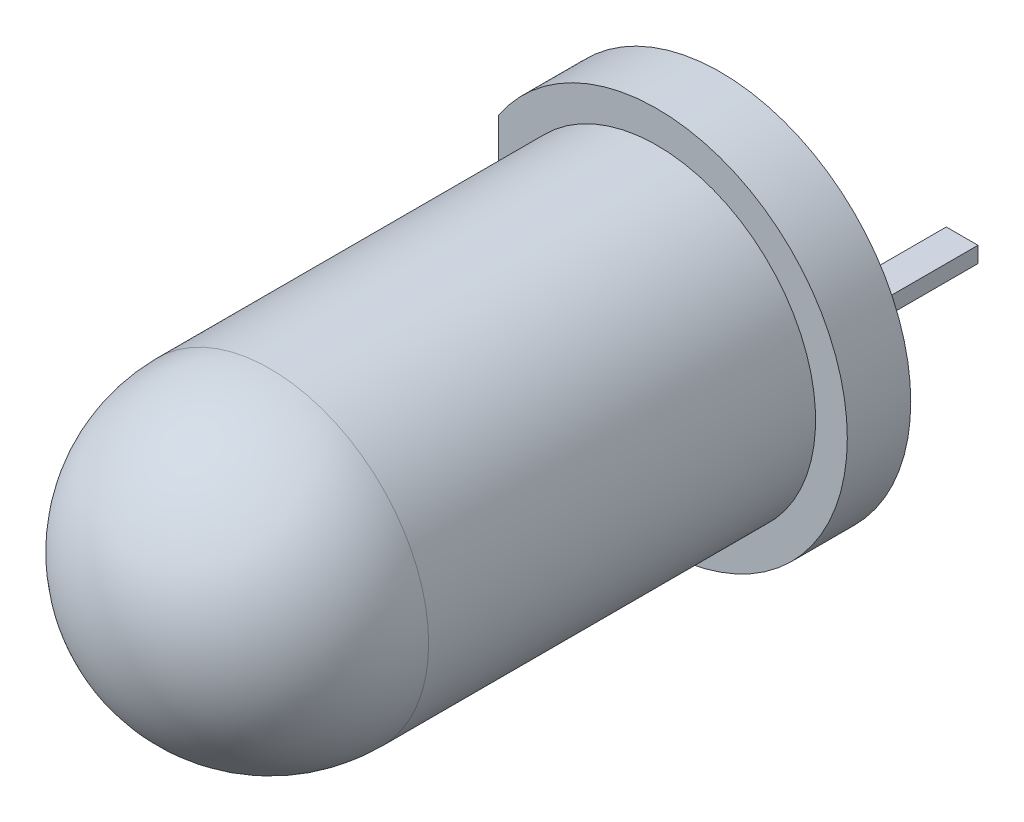
ISO-10303-21;
HEADER;
FILE_DESCRIPTION(('STEP AP214'),'2;1');
FILE_NAME('part.step','',(''),(''),'','','');
FILE_SCHEMA(('AUTOMOTIVE_DESIGN { 1 0 10303 214 1 1 1 1 }'));
ENDSEC;
DATA;
#1=APPLICATION_CONTEXT('core data for automotive mechanical design processes');
#2=APPLICATION_PROTOCOL_DEFINITION('international standard','automotive_design',2000,#1);
#3=PRODUCT_CONTEXT('',#1,'mechanical');
#4=PRODUCT('Part','Part','',(#3));
#5=PRODUCT_RELATED_PRODUCT_CATEGORY('part','',(#4));
#6=PRODUCT_DEFINITION_FORMATION('','',#4);
#7=PRODUCT_DEFINITION_CONTEXT('part definition',#1,'design');
#8=PRODUCT_DEFINITION('design','',#6,#7);
#9=PRODUCT_DEFINITION_SHAPE('','',#8);
#10=(LENGTH_UNIT() NAMED_UNIT(*) SI_UNIT(.MILLI.,.METRE.));
#11=(NAMED_UNIT(*) PLANE_ANGLE_UNIT() SI_UNIT($,.RADIAN.));
#12=(NAMED_UNIT(*) SI_UNIT($,.STERADIAN.) SOLID_ANGLE_UNIT());
#13=UNCERTAINTY_MEASURE_WITH_UNIT(LENGTH_MEASURE(1.E-05),#10,'distance_accuracy_value','');
#14=(GEOMETRIC_REPRESENTATION_CONTEXT(3) GLOBAL_UNCERTAINTY_ASSIGNED_CONTEXT((#13)) GLOBAL_UNIT_ASSIGNED_CONTEXT((#10,
#11,#12)) REPRESENTATION_CONTEXT('',''));
#15=CARTESIAN_POINT('',(0.,0.,0.));
#16=DIRECTION('',(0.,0.,1.));
#17=DIRECTION('',(1.,0.,0.));
#18=AXIS2_PLACEMENT_3D('',#15,#16,#17);
#19=CARTESIAN_POINT('',(-1.52,0.125000000000001,-3.54));
#20=DIRECTION('',(1.,0.,0.));
#21=DIRECTION('',(0.,1.,0.));
#22=AXIS2_PLACEMENT_3D('',#19,#20,#21);
#23=PLANE('',#22);
#24=DIRECTION('',(0.,1.,0.));
#25=VECTOR('',#24,1.);
#26=CARTESIAN_POINT('',(-1.52,0.125000000000001,-2.54));
#27=LINE('',#26,#25);
#28=CARTESIAN_POINT('',(-1.52,-0.124999999999999,-2.54));
#29=VERTEX_POINT('',#28);
#30=CARTESIAN_POINT('',(-1.52,0.125000000000001,-2.54));
#31=VERTEX_POINT('',#30);
#32=EDGE_CURVE('E124',#29,#31,#27,.T.);
#33=ORIENTED_EDGE('',*,*,#32,.F.);
#34=DIRECTION('',(0.,0.,1.));
#35=VECTOR('',#34,1.);
#36=CARTESIAN_POINT('',(-1.52,-0.124999999999999,-3.54));
#37=LINE('',#36,#35);
#38=CARTESIAN_POINT('',(-1.52,-0.124999999999999,-1.));
#39=VERTEX_POINT('',#38);
#40=EDGE_CURVE('E130',#29,#39,#37,.T.);
#41=ORIENTED_EDGE('',*,*,#40,.T.);
#42=DIRECTION('',(0.,1.,0.));
#43=VECTOR('',#42,1.);
#44=CARTESIAN_POINT('',(-1.52,0.125000000000001,-1.));
#45=LINE('',#44,#43);
#46=CARTESIAN_POINT('',(-1.52,0.125000000000001,-1.));
#47=VERTEX_POINT('',#46);
#48=EDGE_CURVE('E170',#39,#47,#45,.T.);
#49=ORIENTED_EDGE('',*,*,#48,.T.);
#50=DIRECTION('',(0.,0.,1.));
#51=VECTOR('',#50,1.);
#52=CARTESIAN_POINT('',(-1.52,0.125000000000001,-3.54));
#53=LINE('',#52,#51);
#54=EDGE_CURVE('E131',#31,#47,#53,.T.);
#55=ORIENTED_EDGE('',*,*,#54,.F.);
#56=EDGE_LOOP('',(#33,#41,#49,#55));
#57=FACE_BOUND('',#56,.T.);
#58=ADVANCED_FACE('F45',(#57),#23,.F.);
#59=CARTESIAN_POINT('',(-1.02,0.125000000000001,-3.54));
#60=DIRECTION('',(0.,-1.,0.));
#61=DIRECTION('',(1.,0.,0.));
#62=AXIS2_PLACEMENT_3D('',#59,#60,#61);
#63=PLANE('',#62);
#64=DIRECTION('',(1.,0.,0.));
#65=VECTOR('',#64,1.);
#66=CARTESIAN_POINT('',(-1.02,0.125000000000001,-2.54));
#67=LINE('',#66,#65);
#68=CARTESIAN_POINT('',(-1.02,0.125000000000001,-2.54));
#69=VERTEX_POINT('',#68);
#70=EDGE_CURVE('E133',#31,#69,#67,.T.);
#71=ORIENTED_EDGE('',*,*,#70,.F.);
#72=ORIENTED_EDGE('',*,*,#54,.T.);
#73=DIRECTION('',(1.,0.,0.));
#74=VECTOR('',#73,1.);
#75=CARTESIAN_POINT('',(-1.02,0.125000000000001,-1.));
#76=LINE('',#75,#74);
#77=CARTESIAN_POINT('',(-1.02,0.125000000000001,-1.));
#78=VERTEX_POINT('',#77);
#79=EDGE_CURVE('E420',#47,#78,#76,.T.);
#80=ORIENTED_EDGE('',*,*,#79,.T.);
#81=DIRECTION('',(0.,0.,1.));
#82=VECTOR('',#81,1.);
#83=CARTESIAN_POINT('',(-1.02,0.125000000000001,-3.54));
#84=LINE('',#83,#82);
#85=EDGE_CURVE('E140',#69,#78,#84,.T.);
#86=ORIENTED_EDGE('',*,*,#85,.F.);
#87=EDGE_LOOP('',(#71,#72,#80,#86));
#88=FACE_BOUND('',#87,.T.);
#89=ADVANCED_FACE('F215',(#88),#63,.F.);
#90=CARTESIAN_POINT('',(-1.02,0.125000000000001,-3.54));
#91=DIRECTION('',(-1.,0.,0.));
#92=DIRECTION('',(0.,0.,1.));
#93=AXIS2_PLACEMENT_3D('',#90,#91,#92);
#94=PLANE('',#93);
#95=DIRECTION('',(0.,-1.,0.));
#96=VECTOR('',#95,1.);
#97=CARTESIAN_POINT('',(-1.02,0.125000000000001,-2.54));
#98=LINE('',#97,#96);
#99=CARTESIAN_POINT('',(-1.02,-0.124999999999999,-2.54));
#100=VERTEX_POINT('',#99);
#101=EDGE_CURVE('E59',#69,#100,#98,.T.);
#102=ORIENTED_EDGE('',*,*,#101,.F.);
#103=ORIENTED_EDGE('',*,*,#85,.T.);
#104=DIRECTION('',(0.,-1.,0.));
#105=VECTOR('',#104,1.);
#106=CARTESIAN_POINT('',(-1.02,0.125000000000001,-1.));
#107=LINE('',#106,#105);
#108=CARTESIAN_POINT('',(-1.02,-0.124999999999999,-1.));
#109=VERTEX_POINT('',#108);
#110=EDGE_CURVE('E142',#78,#109,#107,.T.);
#111=ORIENTED_EDGE('',*,*,#110,.T.);
#112=DIRECTION('',(0.,0.,1.));
#113=VECTOR('',#112,1.);
#114=CARTESIAN_POINT('',(-1.02,-0.124999999999999,-3.54));
#115=LINE('',#114,#113);
#116=EDGE_CURVE('E66',#100,#109,#115,.T.);
#117=ORIENTED_EDGE('',*,*,#116,.F.);
#118=EDGE_LOOP('',(#102,#103,#111,#117));
#119=FACE_BOUND('',#118,.T.);
#120=ADVANCED_FACE('F220',(#119),#94,.F.);
#121=CARTESIAN_POINT('',(-1.02,-0.124999999999999,-3.54));
#122=DIRECTION('',(0.,1.,0.));
#123=DIRECTION('',(-1.,0.,0.));
#124=AXIS2_PLACEMENT_3D('',#121,#122,#123);
#125=PLANE('',#124);
#126=DIRECTION('',(-1.,0.,0.));
#127=VECTOR('',#126,1.);
#128=CARTESIAN_POINT('',(-1.02,-0.124999999999999,-2.54));
#129=LINE('',#128,#127);
#130=EDGE_CURVE('E11',#100,#29,#129,.T.);
#131=ORIENTED_EDGE('',*,*,#130,.F.);
#132=ORIENTED_EDGE('',*,*,#116,.T.);
#133=DIRECTION('',(-1.,0.,0.));
#134=VECTOR('',#133,1.);
#135=CARTESIAN_POINT('',(-1.02,-0.124999999999999,-1.));
#136=LINE('',#135,#134);
#137=EDGE_CURVE('E137',#109,#39,#136,.T.);
#138=ORIENTED_EDGE('',*,*,#137,.T.);
#139=ORIENTED_EDGE('',*,*,#40,.F.);
#140=EDGE_LOOP('',(#131,#132,#138,#139));
#141=FACE_BOUND('',#140,.T.);
#142=ADVANCED_FACE('F135',(#141),#125,.F.);
#143=CARTESIAN_POINT('',(0.,0.,-1.));
#144=DIRECTION('',(0.,0.,-1.));
#145=DIRECTION('',(-1.,0.,0.));
#146=AXIS2_PLACEMENT_3D('',#143,#144,#145);
#147=PLANE('',#146);
#148=DIRECTION('',(0.,1.,0.));
#149=VECTOR('',#148,1.);
#150=CARTESIAN_POINT('',(-2.5,0.,-1.));
#151=LINE('',#150,#149);
#152=CARTESIAN_POINT('',(-2.5,-1.6583123951777,-1.));
#153=VERTEX_POINT('',#152);
#154=CARTESIAN_POINT('',(-2.5,1.6583123951777,-1.));
#155=VERTEX_POINT('',#154);
#156=EDGE_CURVE('E178',#153,#155,#151,.T.);
#157=ORIENTED_EDGE('',*,*,#156,.T.);
#158=CARTESIAN_POINT('',(0.,0.,-1.));
#159=DIRECTION('',(0.,0.,-1.));
#160=DIRECTION('',(-1.,0.,0.));
#161=AXIS2_PLACEMENT_3D('',#158,#159,#160);
#162=CIRCLE('',#161,3.);
#163=EDGE_CURVE('E180',#155,#153,#162,.T.);
#164=ORIENTED_EDGE('',*,*,#163,.T.);
#165=EDGE_LOOP('',(#157,#164));
#166=FACE_BOUND('',#165,.T.);
#167=DIRECTION('',(-1.,0.,0.));
#168=VECTOR('',#167,1.);
#169=CARTESIAN_POINT('',(1.02,-0.125,-1.));
#170=LINE('',#169,#168);
#171=CARTESIAN_POINT('',(1.52,-0.125,-1.));
#172=VERTEX_POINT('',#171);
#173=CARTESIAN_POINT('',(1.02,-0.125,-1.));
#174=VERTEX_POINT('',#173);
#175=EDGE_CURVE('E165',#172,#174,#170,.T.);
#176=ORIENTED_EDGE('',*,*,#175,.F.);
#177=DIRECTION('',(0.,-1.,0.));
#178=VECTOR('',#177,1.);
#179=CARTESIAN_POINT('',(1.52,0.125,-1.));
#180=LINE('',#179,#178);
#181=CARTESIAN_POINT('',(1.52,0.125,-1.));
#182=VERTEX_POINT('',#181);
#183=EDGE_CURVE('E167',#182,#172,#180,.T.);
#184=ORIENTED_EDGE('',*,*,#183,.F.);
#185=DIRECTION('',(1.,0.,0.));
#186=VECTOR('',#185,1.);
#187=CARTESIAN_POINT('',(1.02,0.125,-1.));
#188=LINE('',#187,#186);
#189=CARTESIAN_POINT('',(1.02,0.125,-1.));
#190=VERTEX_POINT('',#189);
#191=EDGE_CURVE('E159',#190,#182,#188,.T.);
#192=ORIENTED_EDGE('',*,*,#191,.F.);
#193=DIRECTION('',(0.,1.,0.));
#194=VECTOR('',#193,1.);
#195=CARTESIAN_POINT('',(1.02,0.125,-1.));
#196=LINE('',#195,#194);
#197=EDGE_CURVE('E161',#174,#190,#196,.T.);
#198=ORIENTED_EDGE('',*,*,#197,.F.);
#199=EDGE_LOOP('',(#176,#184,#192,#198));
#200=FACE_BOUND('',#199,.T.);
#201=ORIENTED_EDGE('',*,*,#79,.F.);
#202=ORIENTED_EDGE('',*,*,#48,.F.);
#203=ORIENTED_EDGE('',*,*,#137,.F.);
#204=ORIENTED_EDGE('',*,*,#110,.F.);
#205=EDGE_LOOP('',(#201,#202,#203,#204));
#206=FACE_BOUND('',#205,.T.);
#207=ADVANCED_FACE('F240',(#166,#200,#206),#147,.T.);
#208=CARTESIAN_POINT('',(0.,0.,8.6));
#209=DIRECTION('',(0.,0.,-1.));
#210=DIRECTION('',(-1.,0.,0.));
#211=AXIS2_PLACEMENT_3D('',#208,#209,#210);
#212=CYLINDRICAL_SURFACE('',#211,2.5);
#213=CARTESIAN_POINT('',(0.,0.,6.1));
#214=DIRECTION('',(0.,0.,-1.));
#215=DIRECTION('',(-1.,0.,0.));
#216=AXIS2_PLACEMENT_3D('',#213,#214,#215);
#217=CIRCLE('',#216,2.5);
#218=CARTESIAN_POINT('',(-2.5,0.,6.1));
#219=VERTEX_POINT('',#218);
#220=EDGE_CURVE('E53',#219,#219,#217,.T.);
#221=ORIENTED_EDGE('',*,*,#220,.T.);
#222=EDGE_LOOP('',(#221));
#223=FACE_BOUND('',#222,.T.);
#224=CARTESIAN_POINT('',(0.,0.,0.));
#225=DIRECTION('',(0.,0.,1.));
#226=DIRECTION('',(1.,0.,0.));
#227=AXIS2_PLACEMENT_3D('',#224,#225,#226);
#228=CIRCLE('',#227,2.5);
#229=CARTESIAN_POINT('',(-2.5,0.,0.));
#230=VERTEX_POINT('',#229);
#231=EDGE_CURVE('E193',#230,#230,#228,.T.);
#232=ORIENTED_EDGE('',*,*,#231,.T.);
#233=EDGE_LOOP('',(#232));
#234=FACE_BOUND('',#233,.T.);
#235=ADVANCED_FACE('F198',(#223,#234),#212,.T.);
#236=CARTESIAN_POINT('',(-2.5,0.,-1.));
#237=DIRECTION('',(1.,0.,0.));
#238=DIRECTION('',(0.,0.,-1.));
#239=AXIS2_PLACEMENT_3D('',#236,#237,#238);
#240=PLANE('',#239);
#241=DIRECTION('',(0.,1.,0.));
#242=VECTOR('',#241,1.);
#243=CARTESIAN_POINT('',(-2.5,0.,0.));
#244=LINE('',#243,#242);
#245=CARTESIAN_POINT('',(-2.5,-1.6583123951777,0.));
#246=VERTEX_POINT('',#245);
#247=EDGE_CURVE('E184',#246,#230,#244,.T.);
#248=ORIENTED_EDGE('',*,*,#247,.T.);
#249=CARTESIAN_POINT('',(-2.5,1.6583123951777,0.));
#250=VERTEX_POINT('',#249);
#251=EDGE_CURVE('E148',#230,#250,#244,.T.);
#252=ORIENTED_EDGE('',*,*,#251,.T.);
#253=DIRECTION('',(0.,0.,1.));
#254=VECTOR('',#253,1.);
#255=CARTESIAN_POINT('',(-2.5,1.6583123951777,-1.));
#256=LINE('',#255,#254);
#257=EDGE_CURVE('E190',#155,#250,#256,.T.);
#258=ORIENTED_EDGE('',*,*,#257,.F.);
#259=ORIENTED_EDGE('',*,*,#156,.F.);
#260=DIRECTION('',(0.,0.,1.));
#261=VECTOR('',#260,1.);
#262=CARTESIAN_POINT('',(-2.5,-1.6583123951777,-1.));
#263=LINE('',#262,#261);
#264=EDGE_CURVE('E183',#153,#246,#263,.T.);
#265=ORIENTED_EDGE('',*,*,#264,.T.);
#266=EDGE_LOOP('',(#248,#252,#258,#259,#265));
#267=FACE_BOUND('',#266,.T.);
#268=ADVANCED_FACE('F246',(#267),#240,.F.);
#269=CARTESIAN_POINT('',(0.,0.,-1.));
#270=DIRECTION('',(0.,0.,1.));
#271=DIRECTION('',(1.,0.,0.));
#272=AXIS2_PLACEMENT_3D('',#269,#270,#271);
#273=CYLINDRICAL_SURFACE('',#272,3.);
#274=CARTESIAN_POINT('',(0.,0.,0.));
#275=DIRECTION('',(0.,0.,-1.));
#276=DIRECTION('',(-1.,0.,0.));
#277=AXIS2_PLACEMENT_3D('',#274,#275,#276);
#278=CIRCLE('',#277,3.);
#279=EDGE_CURVE('E181',#250,#246,#278,.T.);
#280=ORIENTED_EDGE('',*,*,#279,.T.);
#281=ORIENTED_EDGE('',*,*,#264,.F.);
#282=ORIENTED_EDGE('',*,*,#163,.F.);
#283=ORIENTED_EDGE('',*,*,#257,.T.);
#284=EDGE_LOOP('',(#280,#281,#282,#283));
#285=FACE_BOUND('',#284,.T.);
#286=ADVANCED_FACE('F211',(#285),#273,.T.);
#287=CARTESIAN_POINT('',(0.,0.,0.));
#288=DIRECTION('',(0.,0.,-1.));
#289=DIRECTION('',(-1.,0.,0.));
#290=AXIS2_PLACEMENT_3D('',#287,#288,#289);
#291=PLANE('',#290);
#292=ORIENTED_EDGE('',*,*,#251,.F.);
#293=ORIENTED_EDGE('',*,*,#231,.F.);
#294=ORIENTED_EDGE('',*,*,#247,.F.);
#295=ORIENTED_EDGE('',*,*,#279,.F.);
#296=EDGE_LOOP('',(#292,#293,#294,#295));
#297=FACE_BOUND('',#296,.T.);
#298=ADVANCED_FACE('F203',(#297),#291,.F.);
#299=CARTESIAN_POINT('',(0.,0.,6.1));
#300=DIRECTION('',(0.,0.,1.));
#301=DIRECTION('',(1.,0.,0.));
#302=AXIS2_PLACEMENT_3D('',#299,#300,#301);
#303=SPHERICAL_SURFACE('',#302,2.5);
#304=ORIENTED_EDGE('',*,*,#220,.F.);
#305=EDGE_LOOP('',(#304));
#306=FACE_BOUND('',#305,.T.);
#307=ADVANCED_FACE('F47',(#306),#303,.T.);
#308=CARTESIAN_POINT('',(1.52,0.125,-3.54));
#309=DIRECTION('',(-1.,0.,0.));
#310=DIRECTION('',(0.,0.,1.));
#311=AXIS2_PLACEMENT_3D('',#308,#309,#310);
#312=PLANE('',#311);
#313=ORIENTED_EDGE('',*,*,#183,.T.);
#314=DIRECTION('',(0.,0.,1.));
#315=VECTOR('',#314,1.);
#316=CARTESIAN_POINT('',(1.52,-0.125,-3.54));
#317=LINE('',#316,#315);
#318=CARTESIAN_POINT('',(1.52,-0.125,-3.54));
#319=VERTEX_POINT('',#318);
#320=EDGE_CURVE('E132',#319,#172,#317,.T.);
#321=ORIENTED_EDGE('',*,*,#320,.F.);
#322=DIRECTION('',(0.,-1.,0.));
#323=VECTOR('',#322,1.);
#324=CARTESIAN_POINT('',(1.52,0.125,-3.54));
#325=LINE('',#324,#323);
#326=CARTESIAN_POINT('',(1.52,0.125,-3.54));
#327=VERTEX_POINT('',#326);
#328=EDGE_CURVE('E162',#327,#319,#325,.T.);
#329=ORIENTED_EDGE('',*,*,#328,.F.);
#330=DIRECTION('',(0.,0.,1.));
#331=VECTOR('',#330,1.);
#332=CARTESIAN_POINT('',(1.52,0.125,-3.54));
#333=LINE('',#332,#331);
#334=EDGE_CURVE('E155',#327,#182,#333,.T.);
#335=ORIENTED_EDGE('',*,*,#334,.T.);
#336=EDGE_LOOP('',(#313,#321,#329,#335));
#337=FACE_BOUND('',#336,.T.);
#338=ADVANCED_FACE('F202',(#337),#312,.F.);
#339=CARTESIAN_POINT('',(1.02,-0.125,-3.54));
#340=DIRECTION('',(0.,1.,0.));
#341=DIRECTION('',(-1.,0.,0.));
#342=AXIS2_PLACEMENT_3D('',#339,#340,#341);
#343=PLANE('',#342);
#344=ORIENTED_EDGE('',*,*,#175,.T.);
#345=DIRECTION('',(0.,0.,1.));
#346=VECTOR('',#345,1.);
#347=CARTESIAN_POINT('',(1.02,-0.125,-3.54));
#348=LINE('',#347,#346);
#349=CARTESIAN_POINT('',(1.02,-0.125,-3.54));
#350=VERTEX_POINT('',#349);
#351=EDGE_CURVE('E150',#350,#174,#348,.T.);
#352=ORIENTED_EDGE('',*,*,#351,.F.);
#353=DIRECTION('',(-1.,0.,0.));
#354=VECTOR('',#353,1.);
#355=CARTESIAN_POINT('',(1.02,-0.125,-3.54));
#356=LINE('',#355,#354);
#357=EDGE_CURVE('E174',#319,#350,#356,.T.);
#358=ORIENTED_EDGE('',*,*,#357,.F.);
#359=ORIENTED_EDGE('',*,*,#320,.T.);
#360=EDGE_LOOP('',(#344,#352,#358,#359));
#361=FACE_BOUND('',#360,.T.);
#362=ADVANCED_FACE('F208',(#361),#343,.F.);
#363=CARTESIAN_POINT('',(1.02,0.125,-3.54));
#364=DIRECTION('',(1.,0.,0.));
#365=DIRECTION('',(0.,0.,-1.));
#366=AXIS2_PLACEMENT_3D('',#363,#364,#365);
#367=PLANE('',#366);
#368=ORIENTED_EDGE('',*,*,#197,.T.);
#369=DIRECTION('',(0.,0.,1.));
#370=VECTOR('',#369,1.);
#371=CARTESIAN_POINT('',(1.02,0.125,-3.54));
#372=LINE('',#371,#370);
#373=CARTESIAN_POINT('',(1.02,0.125,-3.54));
#374=VERTEX_POINT('',#373);
#375=EDGE_CURVE('E153',#374,#190,#372,.T.);
#376=ORIENTED_EDGE('',*,*,#375,.F.);
#377=DIRECTION('',(0.,1.,0.));
#378=VECTOR('',#377,1.);
#379=CARTESIAN_POINT('',(1.02,0.125,-3.54));
#380=LINE('',#379,#378);
#381=EDGE_CURVE('E172',#350,#374,#380,.T.);
#382=ORIENTED_EDGE('',*,*,#381,.F.);
#383=ORIENTED_EDGE('',*,*,#351,.T.);
#384=EDGE_LOOP('',(#368,#376,#382,#383));
#385=FACE_BOUND('',#384,.T.);
#386=ADVANCED_FACE('F227',(#385),#367,.F.);
#387=CARTESIAN_POINT('',(1.02,0.125,-3.54));
#388=DIRECTION('',(0.,-1.,0.));
#389=DIRECTION('',(1.,0.,0.));
#390=AXIS2_PLACEMENT_3D('',#387,#388,#389);
#391=PLANE('',#390);
#392=ORIENTED_EDGE('',*,*,#191,.T.);
#393=ORIENTED_EDGE('',*,*,#334,.F.);
#394=DIRECTION('',(1.,0.,0.));
#395=VECTOR('',#394,1.);
#396=CARTESIAN_POINT('',(1.02,0.125,-3.54));
#397=LINE('',#396,#395);
#398=EDGE_CURVE('E158',#374,#327,#397,.T.);
#399=ORIENTED_EDGE('',*,*,#398,.F.);
#400=ORIENTED_EDGE('',*,*,#375,.T.);
#401=EDGE_LOOP('',(#392,#393,#399,#400));
#402=FACE_BOUND('',#401,.T.);
#403=ADVANCED_FACE('F231',(#402),#391,.F.);
#404=CARTESIAN_POINT('',(0.,0.,-3.54));
#405=DIRECTION('',(0.,0.,1.));
#406=DIRECTION('',(1.,0.,0.));
#407=AXIS2_PLACEMENT_3D('',#404,#405,#406);
#408=PLANE('',#407);
#409=ORIENTED_EDGE('',*,*,#328,.T.);
#410=ORIENTED_EDGE('',*,*,#357,.T.);
#411=ORIENTED_EDGE('',*,*,#381,.T.);
#412=ORIENTED_EDGE('',*,*,#398,.T.);
#413=EDGE_LOOP('',(#409,#410,#411,#412));
#414=FACE_BOUND('',#413,.T.);
#415=ADVANCED_FACE('F235',(#414),#408,.F.);
#416=CARTESIAN_POINT('',(0.,0.,-2.54));
#417=DIRECTION('',(0.,0.,-1.));
#418=DIRECTION('',(-1.,0.,0.));
#419=AXIS2_PLACEMENT_3D('',#416,#417,#418);
#420=PLANE('',#419);
#421=ORIENTED_EDGE('',*,*,#32,.T.);
#422=ORIENTED_EDGE('',*,*,#70,.T.);
#423=ORIENTED_EDGE('',*,*,#101,.T.);
#424=ORIENTED_EDGE('',*,*,#130,.T.);
#425=EDGE_LOOP('',(#421,#422,#423,#424));
#426=FACE_BOUND('',#425,.T.);
#427=ADVANCED_FACE('F123',(#426),#420,.T.);
#428=CLOSED_SHELL('',(#58,#89,#120,#142,#207,#235,#268,#286,#298,#307,#338,#362,#386,#403,#415,#427));
#429=MANIFOLD_SOLID_BREP('B2',#428);
#430=ADVANCED_BREP_SHAPE_REPRESENTATION('',(#18,#429),#14);
#431=SHAPE_DEFINITION_REPRESENTATION(#9,#430);
ENDSEC;
END-ISO-10303-21;
